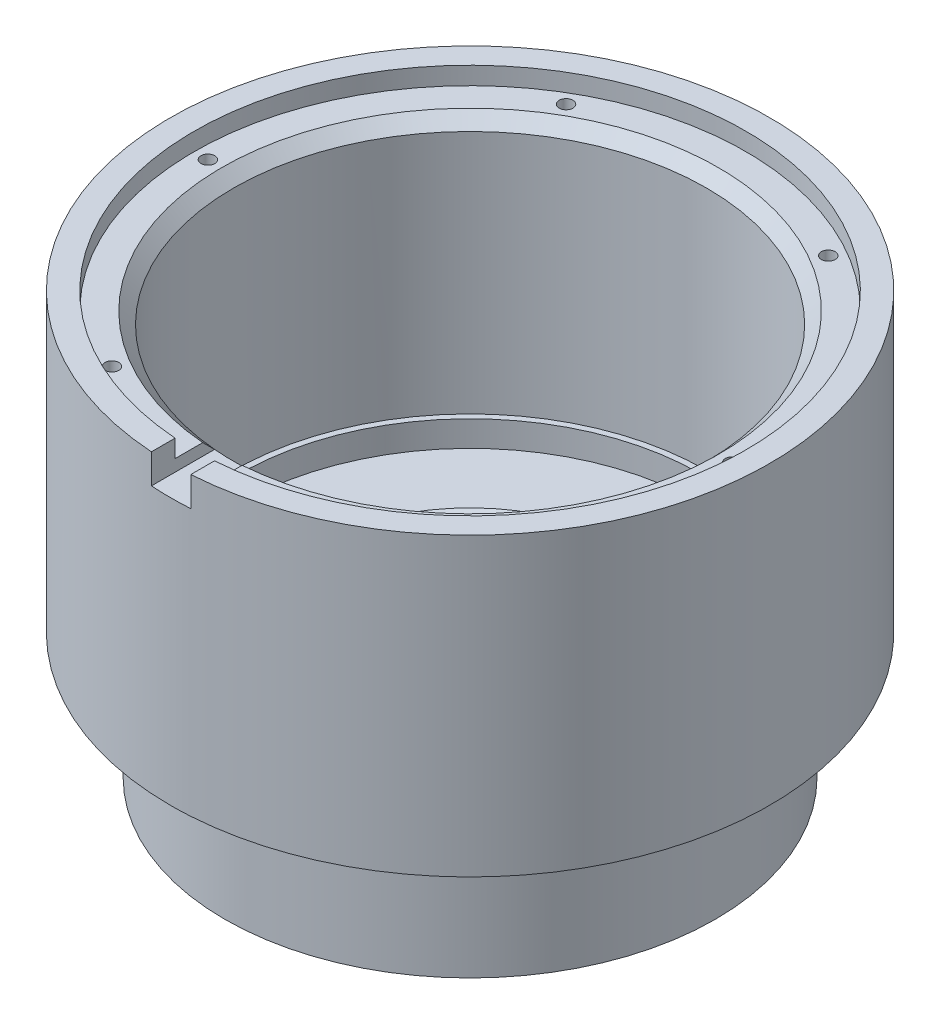
ISO-10303-21;
HEADER;
FILE_DESCRIPTION(('STEP AP214'),'2;1');
FILE_NAME('part.step','',(''),(''),'','','');
FILE_SCHEMA(('AUTOMOTIVE_DESIGN { 1 0 10303 214 1 1 1 1 }'));
ENDSEC;
DATA;
#1=APPLICATION_CONTEXT('core data for automotive mechanical design processes');
#2=APPLICATION_PROTOCOL_DEFINITION('international standard','automotive_design',2000,#1);
#3=PRODUCT_CONTEXT('',#1,'mechanical');
#4=PRODUCT('Part','Part','',(#3));
#5=PRODUCT_RELATED_PRODUCT_CATEGORY('part','',(#4));
#6=PRODUCT_DEFINITION_FORMATION('','',#4);
#7=PRODUCT_DEFINITION_CONTEXT('part definition',#1,'design');
#8=PRODUCT_DEFINITION('design','',#6,#7);
#9=PRODUCT_DEFINITION_SHAPE('','',#8);
#10=(LENGTH_UNIT() NAMED_UNIT(*) SI_UNIT(.MILLI.,.METRE.));
#11=(NAMED_UNIT(*) PLANE_ANGLE_UNIT() SI_UNIT($,.RADIAN.));
#12=(NAMED_UNIT(*) SI_UNIT($,.STERADIAN.) SOLID_ANGLE_UNIT());
#13=UNCERTAINTY_MEASURE_WITH_UNIT(LENGTH_MEASURE(1.E-05),#10,'distance_accuracy_value','');
#14=(GEOMETRIC_REPRESENTATION_CONTEXT(3) GLOBAL_UNCERTAINTY_ASSIGNED_CONTEXT((#13)) GLOBAL_UNIT_ASSIGNED_CONTEXT((#10,
#11,#12)) REPRESENTATION_CONTEXT('',''));
#15=CARTESIAN_POINT('',(0.,0.,0.));
#16=DIRECTION('',(0.,0.,1.));
#17=DIRECTION('',(1.,0.,0.));
#18=AXIS2_PLACEMENT_3D('',#15,#16,#17);
#19=CARTESIAN_POINT('',(-12.5,-14.25,0.));
#20=DIRECTION('',(0.,1.,0.));
#21=DIRECTION('',(0.,0.,1.));
#22=AXIS2_PLACEMENT_3D('',#19,#20,#21);
#23=PLANE('',#22);
#24=CARTESIAN_POINT('',(0.,-14.25,0.));
#25=DIRECTION('',(0.,-1.,0.));
#26=DIRECTION('',(0.,0.,-1.));
#27=AXIS2_PLACEMENT_3D('',#24,#25,#26);
#28=CIRCLE('',#27,12.5);
#29=CARTESIAN_POINT('',(0.,-14.25,-12.5));
#30=VERTEX_POINT('',#29);
#31=EDGE_CURVE('E220',#30,#30,#28,.T.);
#32=ORIENTED_EDGE('',*,*,#31,.F.);
#33=EDGE_LOOP('',(#32));
#34=FACE_BOUND('',#33,.T.);
#35=CARTESIAN_POINT('',(-12.634375,-14.25,21.883379421878));
#36=DIRECTION('',(0.,-1.,0.));
#37=DIRECTION('',(0.,0.,-1.));
#38=AXIS2_PLACEMENT_3D('',#35,#36,#37);
#39=CIRCLE('',#38,2.875);
#40=CARTESIAN_POINT('',(-12.634375,-14.25,19.008379421878));
#41=VERTEX_POINT('',#40);
#42=EDGE_CURVE('E297',#41,#41,#39,.T.);
#43=ORIENTED_EDGE('',*,*,#42,.F.);
#44=EDGE_LOOP('',(#43));
#45=FACE_BOUND('',#44,.T.);
#46=CARTESIAN_POINT('',(12.634375,-14.25,21.883379421878));
#47=DIRECTION('',(0.,-1.,0.));
#48=DIRECTION('',(0.,0.,-1.));
#49=AXIS2_PLACEMENT_3D('',#46,#47,#48);
#50=CIRCLE('',#49,2.875);
#51=CARTESIAN_POINT('',(12.634375,-14.25,19.008379421878));
#52=VERTEX_POINT('',#51);
#53=EDGE_CURVE('E291',#52,#52,#50,.T.);
#54=ORIENTED_EDGE('',*,*,#53,.F.);
#55=EDGE_LOOP('',(#54));
#56=FACE_BOUND('',#55,.T.);
#57=CARTESIAN_POINT('',(25.26875,-14.25,0.));
#58=DIRECTION('',(0.,-1.,0.));
#59=DIRECTION('',(0.,0.,-1.));
#60=AXIS2_PLACEMENT_3D('',#57,#58,#59);
#61=CIRCLE('',#60,2.875);
#62=CARTESIAN_POINT('',(25.26875,-14.25,-2.875));
#63=VERTEX_POINT('',#62);
#64=EDGE_CURVE('E285',#63,#63,#61,.T.);
#65=ORIENTED_EDGE('',*,*,#64,.F.);
#66=EDGE_LOOP('',(#65));
#67=FACE_BOUND('',#66,.T.);
#68=CARTESIAN_POINT('',(12.634375,-14.25,-21.883379421878));
#69=DIRECTION('',(0.,-1.,0.));
#70=DIRECTION('',(0.,0.,-1.));
#71=AXIS2_PLACEMENT_3D('',#68,#69,#70);
#72=CIRCLE('',#71,2.875);
#73=CARTESIAN_POINT('',(12.634375,-14.25,-24.758379421878));
#74=VERTEX_POINT('',#73);
#75=EDGE_CURVE('E278',#74,#74,#72,.T.);
#76=ORIENTED_EDGE('',*,*,#75,.F.);
#77=EDGE_LOOP('',(#76));
#78=FACE_BOUND('',#77,.T.);
#79=CARTESIAN_POINT('',(-12.634375,-14.25,-21.883379421878));
#80=DIRECTION('',(0.,-1.,0.));
#81=DIRECTION('',(0.,0.,-1.));
#82=AXIS2_PLACEMENT_3D('',#79,#80,#81);
#83=CIRCLE('',#82,2.875);
#84=CARTESIAN_POINT('',(-12.634375,-14.25,-24.758379421878));
#85=VERTEX_POINT('',#84);
#86=EDGE_CURVE('E279',#85,#85,#83,.T.);
#87=ORIENTED_EDGE('',*,*,#86,.F.);
#88=EDGE_LOOP('',(#87));
#89=FACE_BOUND('',#88,.T.);
#90=CARTESIAN_POINT('',(-25.26875,-14.25,0.));
#91=DIRECTION('',(0.,-1.,0.));
#92=DIRECTION('',(0.,0.,-1.));
#93=AXIS2_PLACEMENT_3D('',#90,#91,#92);
#94=CIRCLE('',#93,2.875);
#95=CARTESIAN_POINT('',(-25.26875,-14.25,-2.875));
#96=VERTEX_POINT('',#95);
#97=EDGE_CURVE('E300',#96,#96,#94,.T.);
#98=ORIENTED_EDGE('',*,*,#97,.F.);
#99=EDGE_LOOP('',(#98));
#100=FACE_BOUND('',#99,.T.);
#101=CARTESIAN_POINT('',(0.,-14.25,0.));
#102=DIRECTION('',(0.,1.,0.));
#103=DIRECTION('',(0.,0.,1.));
#104=AXIS2_PLACEMENT_3D('',#101,#102,#103);
#105=CIRCLE('',#104,31.14375);
#106=CARTESIAN_POINT('',(0.,-14.25,31.14375));
#107=VERTEX_POINT('',#106);
#108=EDGE_CURVE('E304',#107,#107,#105,.T.);
#109=ORIENTED_EDGE('',*,*,#108,.F.);
#110=EDGE_LOOP('',(#109));
#111=FACE_BOUND('',#110,.T.);
#112=ADVANCED_FACE('F43',(#34,#45,#56,#67,#78,#89,#100,#111),#23,.F.);
#113=CARTESIAN_POINT('',(0.,-30.2318711174091,0.));
#114=DIRECTION('',(0.,-1.,0.));
#115=DIRECTION('',(0.,0.,-1.));
#116=AXIS2_PLACEMENT_3D('',#113,#114,#115);
#117=CYLINDRICAL_SURFACE('',#116,38.0375);
#118=CARTESIAN_POINT('',(0.,1.730108418226,0.));
#119=DIRECTION('',(0.,1.,0.));
#120=DIRECTION('',(0.,0.,1.));
#121=AXIS2_PLACEMENT_3D('',#118,#119,#120);
#122=CIRCLE('',#121,38.0375);
#123=CARTESIAN_POINT('',(0.,1.730108418226,38.0375));
#124=VERTEX_POINT('',#123);
#125=EDGE_CURVE('E189',#124,#124,#122,.T.);
#126=ORIENTED_EDGE('',*,*,#125,.T.);
#127=EDGE_LOOP('',(#126));
#128=FACE_BOUND('',#127,.T.);
#129=CARTESIAN_POINT('',(0.,39.31,0.));
#130=DIRECTION('',(0.,-1.,0.));
#131=DIRECTION('',(0.,0.,-1.));
#132=AXIS2_PLACEMENT_3D('',#129,#130,#131);
#133=CIRCLE('',#132,38.0375);
#134=CARTESIAN_POINT('',(-2.5,39.31,37.9552553179399));
#135=VERTEX_POINT('',#134);
#136=CARTESIAN_POINT('',(2.5,39.31,37.9552553179399));
#137=VERTEX_POINT('',#136);
#138=EDGE_CURVE('E193',#135,#137,#133,.T.);
#139=ORIENTED_EDGE('',*,*,#138,.T.);
#140=DIRECTION('',(0.,-1.,0.));
#141=VECTOR('',#140,1.);
#142=CARTESIAN_POINT('',(2.5,-30.2318711174091,37.9552553179399));
#143=LINE('',#142,#141);
#144=CARTESIAN_POINT('',(2.5,35.56,37.9552553179399));
#145=VERTEX_POINT('',#144);
#146=EDGE_CURVE('E194',#137,#145,#143,.T.);
#147=ORIENTED_EDGE('',*,*,#146,.T.);
#148=CARTESIAN_POINT('',(0.,35.56,0.));
#149=DIRECTION('',(0.,-1.,0.));
#150=DIRECTION('',(0.,0.,-1.));
#151=AXIS2_PLACEMENT_3D('',#148,#149,#150);
#152=CIRCLE('',#151,38.0375);
#153=CARTESIAN_POINT('',(-2.5,35.56,37.9552553179399));
#154=VERTEX_POINT('',#153);
#155=EDGE_CURVE('E116',#145,#154,#152,.T.);
#156=ORIENTED_EDGE('',*,*,#155,.T.);
#157=DIRECTION('',(0.,-1.,0.));
#158=VECTOR('',#157,1.);
#159=CARTESIAN_POINT('',(-2.5,-30.2318711174091,37.9552553179399));
#160=LINE('',#159,#158);
#161=EDGE_CURVE('E195',#154,#135,#160,.F.);
#162=ORIENTED_EDGE('',*,*,#161,.T.);
#163=EDGE_LOOP('',(#139,#147,#156,#162));
#164=FACE_BOUND('',#163,.T.);
#165=ADVANCED_FACE('F147',(#128,#164),#117,.T.);
#166=CARTESIAN_POINT('',(-38.0375,39.31,0.));
#167=DIRECTION('',(0.,-1.,0.));
#168=DIRECTION('',(0.,0.,-1.));
#169=AXIS2_PLACEMENT_3D('',#166,#167,#168);
#170=PLANE('',#169);
#171=CARTESIAN_POINT('',(0.,39.31,0.));
#172=DIRECTION('',(0.,-1.,0.));
#173=DIRECTION('',(0.,0.,-1.));
#174=AXIS2_PLACEMENT_3D('',#171,#172,#173);
#175=CIRCLE('',#174,35.0375);
#176=CARTESIAN_POINT('',(-2.5,39.31,34.9481960371347));
#177=VERTEX_POINT('',#176);
#178=CARTESIAN_POINT('',(2.5,39.31,34.9481960371347));
#179=VERTEX_POINT('',#178);
#180=EDGE_CURVE('E198',#177,#179,#175,.T.);
#181=ORIENTED_EDGE('',*,*,#180,.T.);
#182=DIRECTION('',(0.,0.,-1.));
#183=VECTOR('',#182,1.);
#184=CARTESIAN_POINT('',(2.5,39.31,38.0375));
#185=LINE('',#184,#183);
#186=EDGE_CURVE('E117',#137,#179,#185,.T.);
#187=ORIENTED_EDGE('',*,*,#186,.F.);
#188=ORIENTED_EDGE('',*,*,#138,.F.);
#189=DIRECTION('',(0.,0.,1.));
#190=VECTOR('',#189,1.);
#191=CARTESIAN_POINT('',(-2.5,39.31,38.0375));
#192=LINE('',#191,#190);
#193=EDGE_CURVE('E235',#177,#135,#192,.T.);
#194=ORIENTED_EDGE('',*,*,#193,.F.);
#195=EDGE_LOOP('',(#181,#187,#188,#194));
#196=FACE_BOUND('',#195,.T.);
#197=ADVANCED_FACE('F178',(#196),#170,.F.);
#198=CARTESIAN_POINT('',(0.,-30.2318711174091,0.));
#199=DIRECTION('',(0.,-1.,0.));
#200=DIRECTION('',(0.,0.,-1.));
#201=AXIS2_PLACEMENT_3D('',#198,#199,#200);
#202=CYLINDRICAL_SURFACE('',#201,35.0375);
#203=CARTESIAN_POINT('',(0.,37.06,0.));
#204=DIRECTION('',(0.,-1.,0.));
#205=DIRECTION('',(0.,0.,-1.));
#206=AXIS2_PLACEMENT_3D('',#203,#204,#205);
#207=CIRCLE('',#206,35.0375);
#208=CARTESIAN_POINT('',(-2.5,37.06,34.9481960371347));
#209=VERTEX_POINT('',#208);
#210=CARTESIAN_POINT('',(2.5,37.06,34.9481960371347));
#211=VERTEX_POINT('',#210);
#212=EDGE_CURVE('E200',#209,#211,#207,.T.);
#213=ORIENTED_EDGE('',*,*,#212,.T.);
#214=DIRECTION('',(0.,-1.,0.));
#215=VECTOR('',#214,1.);
#216=CARTESIAN_POINT('',(2.5,-30.2318711174091,34.9481960371347));
#217=LINE('',#216,#215);
#218=EDGE_CURVE('E73',#211,#179,#217,.F.);
#219=ORIENTED_EDGE('',*,*,#218,.T.);
#220=ORIENTED_EDGE('',*,*,#180,.F.);
#221=DIRECTION('',(0.,-1.,0.));
#222=VECTOR('',#221,1.);
#223=CARTESIAN_POINT('',(-2.5,-30.2318711174091,34.9481960371347));
#224=LINE('',#223,#222);
#225=EDGE_CURVE('E228',#177,#209,#224,.T.);
#226=ORIENTED_EDGE('',*,*,#225,.T.);
#227=EDGE_LOOP('',(#213,#219,#220,#226));
#228=FACE_BOUND('',#227,.T.);
#229=ADVANCED_FACE('F174',(#228),#202,.F.);
#230=CARTESIAN_POINT('',(-35.0375,37.06,0.));
#231=DIRECTION('',(0.,-1.,0.));
#232=DIRECTION('',(0.,0.,-1.));
#233=AXIS2_PLACEMENT_3D('',#230,#231,#232);
#234=PLANE('',#233);
#235=CARTESIAN_POINT('',(-33.2875,37.06,0.));
#236=DIRECTION('',(0.,1.,0.));
#237=DIRECTION('',(0.,0.,1.));
#238=AXIS2_PLACEMENT_3D('',#235,#236,#237);
#239=CIRCLE('',#238,0.874999999999998);
#240=CARTESIAN_POINT('',(-33.2875,37.06,0.874999999999998));
#241=VERTEX_POINT('',#240);
#242=EDGE_CURVE('E264',#241,#241,#239,.T.);
#243=ORIENTED_EDGE('',*,*,#242,.F.);
#244=EDGE_LOOP('',(#243));
#245=FACE_BOUND('',#244,.T.);
#246=CARTESIAN_POINT('',(-16.64375,37.06,28.8278206284745));
#247=DIRECTION('',(0.,1.,0.));
#248=DIRECTION('',(0.,0.,1.));
#249=AXIS2_PLACEMENT_3D('',#246,#247,#248);
#250=CIRCLE('',#249,0.875000000000002);
#251=CARTESIAN_POINT('',(-16.64375,37.06,29.7028206284745));
#252=VERTEX_POINT('',#251);
#253=EDGE_CURVE('E243',#252,#252,#250,.T.);
#254=ORIENTED_EDGE('',*,*,#253,.F.);
#255=EDGE_LOOP('',(#254));
#256=FACE_BOUND('',#255,.T.);
#257=CARTESIAN_POINT('',(16.64375,37.06,28.8278206284745));
#258=DIRECTION('',(0.,1.,0.));
#259=DIRECTION('',(0.,0.,1.));
#260=AXIS2_PLACEMENT_3D('',#257,#258,#259);
#261=CIRCLE('',#260,0.875000000000002);
#262=CARTESIAN_POINT('',(16.64375,37.06,29.7028206284745));
#263=VERTEX_POINT('',#262);
#264=EDGE_CURVE('E242',#263,#263,#261,.T.);
#265=ORIENTED_EDGE('',*,*,#264,.F.);
#266=EDGE_LOOP('',(#265));
#267=FACE_BOUND('',#266,.T.);
#268=CARTESIAN_POINT('',(33.2875,37.06,0.));
#269=DIRECTION('',(0.,1.,0.));
#270=DIRECTION('',(0.,0.,1.));
#271=AXIS2_PLACEMENT_3D('',#268,#269,#270);
#272=CIRCLE('',#271,0.874999999999998);
#273=CARTESIAN_POINT('',(33.2875,37.06,0.874999999999995));
#274=VERTEX_POINT('',#273);
#275=EDGE_CURVE('E249',#274,#274,#272,.T.);
#276=ORIENTED_EDGE('',*,*,#275,.F.);
#277=EDGE_LOOP('',(#276));
#278=FACE_BOUND('',#277,.T.);
#279=CARTESIAN_POINT('',(16.64375,37.06,-28.8278206284745));
#280=DIRECTION('',(0.,1.,0.));
#281=DIRECTION('',(0.,0.,1.));
#282=AXIS2_PLACEMENT_3D('',#279,#280,#281);
#283=CIRCLE('',#282,0.875000000000002);
#284=CARTESIAN_POINT('',(16.64375,37.06,-27.9528206284745));
#285=VERTEX_POINT('',#284);
#286=EDGE_CURVE('E255',#285,#285,#283,.T.);
#287=ORIENTED_EDGE('',*,*,#286,.F.);
#288=EDGE_LOOP('',(#287));
#289=FACE_BOUND('',#288,.T.);
#290=CARTESIAN_POINT('',(-16.64375,37.06,-28.8278206284745));
#291=DIRECTION('',(0.,1.,0.));
#292=DIRECTION('',(0.,0.,1.));
#293=AXIS2_PLACEMENT_3D('',#290,#291,#292);
#294=CIRCLE('',#293,0.875000000000002);
#295=CARTESIAN_POINT('',(-16.64375,37.06,-27.9528206284745));
#296=VERTEX_POINT('',#295);
#297=EDGE_CURVE('E261',#296,#296,#294,.T.);
#298=ORIENTED_EDGE('',*,*,#297,.F.);
#299=EDGE_LOOP('',(#298));
#300=FACE_BOUND('',#299,.T.);
#301=CARTESIAN_POINT('',(0.,37.06,0.));
#302=DIRECTION('',(0.,-1.,0.));
#303=DIRECTION('',(0.,0.,-1.));
#304=AXIS2_PLACEMENT_3D('',#301,#302,#303);
#305=CIRCLE('',#304,31.5375);
#306=CARTESIAN_POINT('',(-2.5,37.06,31.4382554581198));
#307=VERTEX_POINT('',#306);
#308=CARTESIAN_POINT('',(2.5,37.06,31.4382554581198));
#309=VERTEX_POINT('',#308);
#310=EDGE_CURVE('E122',#307,#309,#305,.T.);
#311=ORIENTED_EDGE('',*,*,#310,.T.);
#312=DIRECTION('',(0.,0.,1.));
#313=VECTOR('',#312,1.);
#314=CARTESIAN_POINT('',(2.49999999999999,37.06,0.));
#315=LINE('',#314,#313);
#316=EDGE_CURVE('E106',#309,#211,#315,.T.);
#317=ORIENTED_EDGE('',*,*,#316,.T.);
#318=ORIENTED_EDGE('',*,*,#212,.F.);
#319=DIRECTION('',(0.,0.,-1.));
#320=VECTOR('',#319,1.);
#321=CARTESIAN_POINT('',(-2.5,37.06,0.));
#322=LINE('',#321,#320);
#323=EDGE_CURVE('E231',#209,#307,#322,.T.);
#324=ORIENTED_EDGE('',*,*,#323,.T.);
#325=EDGE_LOOP('',(#311,#317,#318,#324));
#326=FACE_BOUND('',#325,.T.);
#327=ADVANCED_FACE('F171',(#245,#256,#267,#278,#289,#300,#326),#234,.F.);
#328=CARTESIAN_POINT('',(0.,-30.2318711174091,0.));
#329=DIRECTION('',(0.,-1.,0.));
#330=DIRECTION('',(0.,0.,-1.));
#331=AXIS2_PLACEMENT_3D('',#328,#329,#330);
#332=CYLINDRICAL_SURFACE('',#331,30.0375);
#333=CARTESIAN_POINT('',(0.,35.56,0.));
#334=DIRECTION('',(0.,-1.,0.));
#335=DIRECTION('',(0.,0.,-1.));
#336=AXIS2_PLACEMENT_3D('',#333,#334,#335);
#337=CIRCLE('',#336,30.0375);
#338=CARTESIAN_POINT('',(-2.5,35.56,29.9332825839399));
#339=VERTEX_POINT('',#338);
#340=CARTESIAN_POINT('',(2.5,35.56,29.9332825839399));
#341=VERTEX_POINT('',#340);
#342=EDGE_CURVE('E114',#339,#341,#337,.F.);
#343=ORIENTED_EDGE('',*,*,#342,.T.);
#344=EDGE_CURVE('E120',#341,#339,#337,.F.);
#345=ORIENTED_EDGE('',*,*,#344,.T.);
#346=EDGE_LOOP('',(#343,#345));
#347=FACE_BOUND('',#346,.T.);
#348=CARTESIAN_POINT('',(0.,4.50500000000001,0.));
#349=DIRECTION('',(0.,-1.,0.));
#350=DIRECTION('',(0.,0.,-1.));
#351=AXIS2_PLACEMENT_3D('',#348,#349,#350);
#352=CIRCLE('',#351,30.0375);
#353=CARTESIAN_POINT('',(0.,4.50500000000001,-30.0375));
#354=VERTEX_POINT('',#353);
#355=EDGE_CURVE('E205',#354,#354,#352,.T.);
#356=ORIENTED_EDGE('',*,*,#355,.T.);
#357=EDGE_LOOP('',(#356));
#358=FACE_BOUND('',#357,.T.);
#359=ADVANCED_FACE('F124',(#347,#358),#332,.F.);
#360=CARTESIAN_POINT('',(-30.0375,4.50500000000001,0.));
#361=DIRECTION('',(0.,-1.,0.));
#362=DIRECTION('',(0.,0.,-1.));
#363=AXIS2_PLACEMENT_3D('',#360,#361,#362);
#364=PLANE('',#363);
#365=ORIENTED_EDGE('',*,*,#355,.F.);
#366=EDGE_LOOP('',(#365));
#367=FACE_BOUND('',#366,.T.);
#368=CARTESIAN_POINT('',(0.,4.50500000000001,0.));
#369=DIRECTION('',(0.,-1.,0.));
#370=DIRECTION('',(0.,0.,-1.));
#371=AXIS2_PLACEMENT_3D('',#368,#369,#370);
#372=CIRCLE('',#371,29.2875);
#373=CARTESIAN_POINT('',(0.,4.50500000000001,-29.2875));
#374=VERTEX_POINT('',#373);
#375=EDGE_CURVE('E208',#374,#374,#372,.T.);
#376=ORIENTED_EDGE('',*,*,#375,.T.);
#377=EDGE_LOOP('',(#376));
#378=FACE_BOUND('',#377,.T.);
#379=ADVANCED_FACE('F164',(#367,#378),#364,.F.);
#380=CARTESIAN_POINT('',(0.,-30.2318711174091,0.));
#381=DIRECTION('',(0.,-1.,0.));
#382=DIRECTION('',(0.,0.,-1.));
#383=AXIS2_PLACEMENT_3D('',#380,#381,#382);
#384=CYLINDRICAL_SURFACE('',#383,29.2875);
#385=ORIENTED_EDGE('',*,*,#375,.F.);
#386=EDGE_LOOP('',(#385));
#387=FACE_BOUND('',#386,.T.);
#388=CARTESIAN_POINT('',(0.,1.25,0.));
#389=DIRECTION('',(0.,-1.,0.));
#390=DIRECTION('',(0.,0.,-1.));
#391=AXIS2_PLACEMENT_3D('',#388,#389,#390);
#392=CIRCLE('',#391,29.2875);
#393=CARTESIAN_POINT('',(0.,1.25,-29.2875));
#394=VERTEX_POINT('',#393);
#395=EDGE_CURVE('E211',#394,#394,#392,.T.);
#396=ORIENTED_EDGE('',*,*,#395,.T.);
#397=EDGE_LOOP('',(#396));
#398=FACE_BOUND('',#397,.T.);
#399=ADVANCED_FACE('F160',(#387,#398),#384,.F.);
#400=CARTESIAN_POINT('',(-20.0375,1.25,0.));
#401=DIRECTION('',(0.,-1.,0.));
#402=DIRECTION('',(0.,0.,-1.));
#403=AXIS2_PLACEMENT_3D('',#400,#401,#402);
#404=PLANE('',#403);
#405=ORIENTED_EDGE('',*,*,#395,.F.);
#406=EDGE_LOOP('',(#405));
#407=FACE_BOUND('',#406,.T.);
#408=CARTESIAN_POINT('',(0.,1.25,0.));
#409=DIRECTION('',(0.,-1.,0.));
#410=DIRECTION('',(0.,0.,-1.));
#411=AXIS2_PLACEMENT_3D('',#408,#409,#410);
#412=CIRCLE('',#411,20.0375);
#413=CARTESIAN_POINT('',(0.,1.25,-20.0375));
#414=VERTEX_POINT('',#413);
#415=EDGE_CURVE('E214',#414,#414,#412,.T.);
#416=ORIENTED_EDGE('',*,*,#415,.T.);
#417=EDGE_LOOP('',(#416));
#418=FACE_BOUND('',#417,.T.);
#419=ADVANCED_FACE('F156',(#407,#418),#404,.F.);
#420=CARTESIAN_POINT('',(0.,-1.25,0.));
#421=DIRECTION('',(0.,1.,0.));
#422=DIRECTION('',(0.,0.,1.));
#423=AXIS2_PLACEMENT_3D('',#420,#421,#422);
#424=CONICAL_SURFACE('',#423,12.5,1.25053905152723);
#425=ORIENTED_EDGE('',*,*,#415,.F.);
#426=EDGE_LOOP('',(#425));
#427=FACE_BOUND('',#426,.T.);
#428=CARTESIAN_POINT('',(0.,-1.25,0.));
#429=DIRECTION('',(0.,-1.,0.));
#430=DIRECTION('',(0.,0.,-1.));
#431=AXIS2_PLACEMENT_3D('',#428,#429,#430);
#432=CIRCLE('',#431,12.5);
#433=CARTESIAN_POINT('',(0.,-1.25,-12.5));
#434=VERTEX_POINT('',#433);
#435=EDGE_CURVE('E217',#434,#434,#432,.T.);
#436=ORIENTED_EDGE('',*,*,#435,.T.);
#437=EDGE_LOOP('',(#436));
#438=FACE_BOUND('',#437,.T.);
#439=ADVANCED_FACE('F152',(#427,#438),#424,.F.);
#440=CARTESIAN_POINT('',(0.,-30.2318711174091,0.));
#441=DIRECTION('',(0.,-1.,0.));
#442=DIRECTION('',(0.,0.,-1.));
#443=AXIS2_PLACEMENT_3D('',#440,#441,#442);
#444=CYLINDRICAL_SURFACE('',#443,12.5);
#445=ORIENTED_EDGE('',*,*,#435,.F.);
#446=EDGE_LOOP('',(#445));
#447=FACE_BOUND('',#446,.T.);
#448=ORIENTED_EDGE('',*,*,#31,.T.);
#449=EDGE_LOOP('',(#448));
#450=FACE_BOUND('',#449,.T.);
#451=ADVANCED_FACE('F149',(#447,#450),#444,.F.);
#452=CARTESIAN_POINT('',(0.,37.06,0.));
#453=DIRECTION('',(0.,1.,0.));
#454=DIRECTION('',(0.,0.,1.));
#455=AXIS2_PLACEMENT_3D('',#452,#453,#454);
#456=CONICAL_SURFACE('',#455,31.5375,0.785398163397436);
#457=CARTESIAN_POINT('',(2.5,39.2564498760365,33.6411856842017));
#458=CARTESIAN_POINT('',(2.5,38.7659165604654,33.1492992082919));
#459=CARTESIAN_POINT('',(2.5,38.2754123379568,32.6573837168512));
#460=CARTESIAN_POINT('',(2.5,37.2944718161019,31.6734850406487));
#461=CARTESIAN_POINT('',(2.5,36.8040355167539,31.1815018558887));
#462=CARTESIAN_POINT('',(2.5,35.8232405497736,30.1974581022259));
#463=CARTESIAN_POINT('',(2.5,35.3328818821417,29.7053975333225));
#464=CARTESIAN_POINT('',(2.5,34.3522551657301,28.7211860822988));
#465=CARTESIAN_POINT('',(2.5,33.8619871169527,28.2290352001761));
#466=CARTESIAN_POINT('',(2.5,33.3717708821294,27.7368327079034));
#467=B_SPLINE_CURVE_WITH_KNOTS('',3,(#457,#458,#459,#460,#461,#462,#463,#464,#465,#466),
.UNSPECIFIED.,.F.,.F.,(4,2,2,2,4),(0.,2.08402906775415,4.1680580820119,6.25208711029352,
8.33611619216041),.UNSPECIFIED.);
#468=EDGE_CURVE('E12',#309,#341,#467,.T.);
#469=ORIENTED_EDGE('',*,*,#468,.F.);
#470=ORIENTED_EDGE('',*,*,#310,.F.);
#471=CARTESIAN_POINT('',(-2.5,33.3717708821294,27.7368327079034));
#472=CARTESIAN_POINT('',(-2.5,33.8619871169527,28.2290352001761));
#473=CARTESIAN_POINT('',(-2.5,34.3522551657301,28.7211860822988));
#474=CARTESIAN_POINT('',(-2.5,35.3328818821417,29.7053975333225));
#475=CARTESIAN_POINT('',(-2.5,35.8232405497736,30.1974581022259));
#476=CARTESIAN_POINT('',(-2.5,36.8040355167539,31.1815018558887));
#477=CARTESIAN_POINT('',(-2.5,37.2944718161019,31.6734850406487));
#478=CARTESIAN_POINT('',(-2.5,38.2754123379567,32.6573837168512));
#479=CARTESIAN_POINT('',(-2.5,38.7659165604654,33.1492992082919));
#480=CARTESIAN_POINT('',(-2.5,39.2564498760365,33.6411856842017));
#481=B_SPLINE_CURVE_WITH_KNOTS('',3,(#471,#472,#473,#474,#475,#476,#477,#478,#479,#480),
.UNSPECIFIED.,.F.,.F.,(4,2,2,2,4),(0.,2.08402908186689,4.16805811014851,6.25208712440626,
8.33611619216041),.UNSPECIFIED.);
#482=EDGE_CURVE('E58',#339,#307,#481,.T.);
#483=ORIENTED_EDGE('',*,*,#482,.F.);
#484=ORIENTED_EDGE('',*,*,#344,.F.);
#485=EDGE_LOOP('',(#469,#470,#483,#484));
#486=FACE_BOUND('',#485,.T.);
#487=ADVANCED_FACE('F46',(#486),#456,.F.);
#488=CARTESIAN_POINT('',(0.,35.56,0.));
#489=DIRECTION('',(0.,-1.,0.));
#490=DIRECTION('',(0.,0.,-1.));
#491=AXIS2_PLACEMENT_3D('',#488,#489,#490);
#492=PLANE('',#491);
#493=DIRECTION('',(0.,0.,-1.));
#494=VECTOR('',#493,1.);
#495=CARTESIAN_POINT('',(2.5,35.56,38.0375));
#496=LINE('',#495,#494);
#497=EDGE_CURVE('E104',#145,#341,#496,.T.);
#498=ORIENTED_EDGE('',*,*,#497,.T.);
#499=ORIENTED_EDGE('',*,*,#342,.F.);
#500=DIRECTION('',(0.,0.,1.));
#501=VECTOR('',#500,1.);
#502=CARTESIAN_POINT('',(-2.5,35.56,38.0375));
#503=LINE('',#502,#501);
#504=EDGE_CURVE('E65',#339,#154,#503,.T.);
#505=ORIENTED_EDGE('',*,*,#504,.T.);
#506=ORIENTED_EDGE('',*,*,#155,.F.);
#507=EDGE_LOOP('',(#498,#499,#505,#506));
#508=FACE_BOUND('',#507,.T.);
#509=ADVANCED_FACE('F112',(#508),#492,.F.);
#510=CARTESIAN_POINT('',(2.5,26.0374824795765,38.0375));
#511=DIRECTION('',(1.,0.,0.));
#512=DIRECTION('',(0.,0.,-1.));
#513=AXIS2_PLACEMENT_3D('',#510,#511,#512);
#514=PLANE('',#513);
#515=ORIENTED_EDGE('',*,*,#186,.T.);
#516=ORIENTED_EDGE('',*,*,#218,.F.);
#517=ORIENTED_EDGE('',*,*,#316,.F.);
#518=ORIENTED_EDGE('',*,*,#468,.T.);
#519=ORIENTED_EDGE('',*,*,#497,.F.);
#520=ORIENTED_EDGE('',*,*,#146,.F.);
#521=EDGE_LOOP('',(#515,#516,#517,#518,#519,#520));
#522=FACE_BOUND('',#521,.T.);
#523=ADVANCED_FACE('F103',(#522),#514,.F.);
#524=CARTESIAN_POINT('',(-2.5,26.0374824795765,38.0375));
#525=DIRECTION('',(-1.,0.,0.));
#526=DIRECTION('',(0.,0.,1.));
#527=AXIS2_PLACEMENT_3D('',#524,#525,#526);
#528=PLANE('',#527);
#529=ORIENTED_EDGE('',*,*,#504,.F.);
#530=ORIENTED_EDGE('',*,*,#482,.T.);
#531=ORIENTED_EDGE('',*,*,#323,.F.);
#532=ORIENTED_EDGE('',*,*,#225,.F.);
#533=ORIENTED_EDGE('',*,*,#193,.T.);
#534=ORIENTED_EDGE('',*,*,#161,.F.);
#535=EDGE_LOOP('',(#529,#530,#531,#532,#533,#534));
#536=FACE_BOUND('',#535,.T.);
#537=ADVANCED_FACE('F133',(#536),#528,.F.);
#538=CARTESIAN_POINT('',(-16.64375,31.06,-28.8278206284745));
#539=DIRECTION('',(0.,1.,0.));
#540=DIRECTION('',(0.,0.,1.));
#541=AXIS2_PLACEMENT_3D('',#538,#539,#540);
#542=CYLINDRICAL_SURFACE('',#541,0.875000000000002);
#543=CARTESIAN_POINT('',(-16.64375,31.06,-28.8278206284745));
#544=DIRECTION('',(0.,1.,0.));
#545=DIRECTION('',(0.,0.,1.));
#546=AXIS2_PLACEMENT_3D('',#543,#544,#545);
#547=CIRCLE('',#546,0.875000000000002);
#548=CARTESIAN_POINT('',(-16.64375,31.06,-27.9528206284745));
#549=VERTEX_POINT('',#548);
#550=EDGE_CURVE('E258',#549,#549,#547,.T.);
#551=ORIENTED_EDGE('',*,*,#550,.F.);
#552=EDGE_LOOP('',(#551));
#553=FACE_BOUND('',#552,.T.);
#554=ORIENTED_EDGE('',*,*,#297,.T.);
#555=EDGE_LOOP('',(#554));
#556=FACE_BOUND('',#555,.T.);
#557=ADVANCED_FACE('F137',(#553,#556),#542,.F.);
#558=CARTESIAN_POINT('',(-16.64375,31.06,-28.8278206284745));
#559=DIRECTION('',(0.,1.,0.));
#560=DIRECTION('',(0.,0.,1.));
#561=AXIS2_PLACEMENT_3D('',#558,#559,#560);
#562=PLANE('',#561);
#563=ORIENTED_EDGE('',*,*,#550,.T.);
#564=EDGE_LOOP('',(#563));
#565=FACE_BOUND('',#564,.T.);
#566=ADVANCED_FACE('F398',(#565),#562,.T.);
#567=CARTESIAN_POINT('',(16.64375,31.06,-28.8278206284745));
#568=DIRECTION('',(0.,1.,0.));
#569=DIRECTION('',(0.,0.,1.));
#570=AXIS2_PLACEMENT_3D('',#567,#568,#569);
#571=CYLINDRICAL_SURFACE('',#570,0.875000000000002);
#572=CARTESIAN_POINT('',(16.64375,31.06,-28.8278206284745));
#573=DIRECTION('',(0.,1.,0.));
#574=DIRECTION('',(0.,0.,1.));
#575=AXIS2_PLACEMENT_3D('',#572,#573,#574);
#576=CIRCLE('',#575,0.875000000000002);
#577=CARTESIAN_POINT('',(16.64375,31.06,-27.9528206284745));
#578=VERTEX_POINT('',#577);
#579=EDGE_CURVE('E252',#578,#578,#576,.T.);
#580=ORIENTED_EDGE('',*,*,#579,.F.);
#581=EDGE_LOOP('',(#580));
#582=FACE_BOUND('',#581,.T.);
#583=ORIENTED_EDGE('',*,*,#286,.T.);
#584=EDGE_LOOP('',(#583));
#585=FACE_BOUND('',#584,.T.);
#586=ADVANCED_FACE('F402',(#582,#585),#571,.F.);
#587=CARTESIAN_POINT('',(16.64375,31.06,-28.8278206284745));
#588=DIRECTION('',(0.,1.,0.));
#589=DIRECTION('',(0.,0.,1.));
#590=AXIS2_PLACEMENT_3D('',#587,#588,#589);
#591=PLANE('',#590);
#592=ORIENTED_EDGE('',*,*,#579,.T.);
#593=EDGE_LOOP('',(#592));
#594=FACE_BOUND('',#593,.T.);
#595=ADVANCED_FACE('F406',(#594),#591,.T.);
#596=CARTESIAN_POINT('',(33.2875,31.06,0.));
#597=DIRECTION('',(0.,1.,0.));
#598=DIRECTION('',(0.,0.,1.));
#599=AXIS2_PLACEMENT_3D('',#596,#597,#598);
#600=CYLINDRICAL_SURFACE('',#599,0.874999999999998);
#601=CARTESIAN_POINT('',(33.2875,31.06,0.));
#602=DIRECTION('',(0.,1.,0.));
#603=DIRECTION('',(0.,0.,1.));
#604=AXIS2_PLACEMENT_3D('',#601,#602,#603);
#605=CIRCLE('',#604,0.874999999999998);
#606=CARTESIAN_POINT('',(33.2875,31.06,0.874999999999995));
#607=VERTEX_POINT('',#606);
#608=EDGE_CURVE('E246',#607,#607,#605,.T.);
#609=ORIENTED_EDGE('',*,*,#608,.F.);
#610=EDGE_LOOP('',(#609));
#611=FACE_BOUND('',#610,.T.);
#612=ORIENTED_EDGE('',*,*,#275,.T.);
#613=EDGE_LOOP('',(#612));
#614=FACE_BOUND('',#613,.T.);
#615=ADVANCED_FACE('F410',(#611,#614),#600,.F.);
#616=CARTESIAN_POINT('',(33.2875,31.06,0.));
#617=DIRECTION('',(0.,1.,0.));
#618=DIRECTION('',(0.,0.,1.));
#619=AXIS2_PLACEMENT_3D('',#616,#617,#618);
#620=PLANE('',#619);
#621=ORIENTED_EDGE('',*,*,#608,.T.);
#622=EDGE_LOOP('',(#621));
#623=FACE_BOUND('',#622,.T.);
#624=ADVANCED_FACE('F414',(#623),#620,.T.);
#625=CARTESIAN_POINT('',(16.64375,31.06,28.8278206284745));
#626=DIRECTION('',(0.,1.,0.));
#627=DIRECTION('',(0.,0.,1.));
#628=AXIS2_PLACEMENT_3D('',#625,#626,#627);
#629=CYLINDRICAL_SURFACE('',#628,0.875000000000002);
#630=CARTESIAN_POINT('',(16.64375,31.06,28.8278206284745));
#631=DIRECTION('',(0.,1.,0.));
#632=DIRECTION('',(0.,0.,1.));
#633=AXIS2_PLACEMENT_3D('',#630,#631,#632);
#634=CIRCLE('',#633,0.875000000000002);
#635=CARTESIAN_POINT('',(16.64375,31.06,29.7028206284745));
#636=VERTEX_POINT('',#635);
#637=EDGE_CURVE('E239',#636,#636,#634,.T.);
#638=ORIENTED_EDGE('',*,*,#637,.F.);
#639=EDGE_LOOP('',(#638));
#640=FACE_BOUND('',#639,.T.);
#641=ORIENTED_EDGE('',*,*,#264,.T.);
#642=EDGE_LOOP('',(#641));
#643=FACE_BOUND('',#642,.T.);
#644=ADVANCED_FACE('F417',(#640,#643),#629,.F.);
#645=CARTESIAN_POINT('',(16.64375,31.06,28.8278206284745));
#646=DIRECTION('',(0.,1.,0.));
#647=DIRECTION('',(0.,0.,1.));
#648=AXIS2_PLACEMENT_3D('',#645,#646,#647);
#649=PLANE('',#648);
#650=ORIENTED_EDGE('',*,*,#637,.T.);
#651=EDGE_LOOP('',(#650));
#652=FACE_BOUND('',#651,.T.);
#653=ADVANCED_FACE('F138',(#652),#649,.T.);
#654=CARTESIAN_POINT('',(-16.64375,31.06,28.8278206284745));
#655=DIRECTION('',(0.,1.,0.));
#656=DIRECTION('',(0.,0.,1.));
#657=AXIS2_PLACEMENT_3D('',#654,#655,#656);
#658=CYLINDRICAL_SURFACE('',#657,0.875000000000002);
#659=CARTESIAN_POINT('',(-16.64375,31.06,28.8278206284745));
#660=DIRECTION('',(0.,1.,0.));
#661=DIRECTION('',(0.,0.,1.));
#662=AXIS2_PLACEMENT_3D('',#659,#660,#661);
#663=CIRCLE('',#662,0.875000000000002);
#664=CARTESIAN_POINT('',(-16.64375,31.06,29.7028206284745));
#665=VERTEX_POINT('',#664);
#666=EDGE_CURVE('E265',#665,#665,#663,.T.);
#667=ORIENTED_EDGE('',*,*,#666,.F.);
#668=EDGE_LOOP('',(#667));
#669=FACE_BOUND('',#668,.T.);
#670=ORIENTED_EDGE('',*,*,#253,.T.);
#671=EDGE_LOOP('',(#670));
#672=FACE_BOUND('',#671,.T.);
#673=ADVANCED_FACE('F389',(#669,#672),#658,.F.);
#674=CARTESIAN_POINT('',(-16.64375,31.06,28.8278206284745));
#675=DIRECTION('',(0.,1.,0.));
#676=DIRECTION('',(0.,0.,1.));
#677=AXIS2_PLACEMENT_3D('',#674,#675,#676);
#678=PLANE('',#677);
#679=ORIENTED_EDGE('',*,*,#666,.T.);
#680=EDGE_LOOP('',(#679));
#681=FACE_BOUND('',#680,.T.);
#682=ADVANCED_FACE('F387',(#681),#678,.T.);
#683=CARTESIAN_POINT('',(-33.2875,31.06,0.));
#684=DIRECTION('',(0.,1.,0.));
#685=DIRECTION('',(0.,0.,1.));
#686=AXIS2_PLACEMENT_3D('',#683,#684,#685);
#687=CYLINDRICAL_SURFACE('',#686,0.874999999999998);
#688=CARTESIAN_POINT('',(-33.2875,31.06,0.));
#689=DIRECTION('',(0.,1.,0.));
#690=DIRECTION('',(0.,0.,1.));
#691=AXIS2_PLACEMENT_3D('',#688,#689,#690);
#692=CIRCLE('',#691,0.874999999999998);
#693=CARTESIAN_POINT('',(-33.2875,31.06,0.874999999999998));
#694=VERTEX_POINT('',#693);
#695=EDGE_CURVE('E237',#694,#694,#692,.T.);
#696=ORIENTED_EDGE('',*,*,#695,.F.);
#697=EDGE_LOOP('',(#696));
#698=FACE_BOUND('',#697,.T.);
#699=ORIENTED_EDGE('',*,*,#242,.T.);
#700=EDGE_LOOP('',(#699));
#701=FACE_BOUND('',#700,.T.);
#702=ADVANCED_FACE('F383',(#698,#701),#687,.F.);
#703=CARTESIAN_POINT('',(-33.2875,31.06,0.));
#704=DIRECTION('',(0.,1.,0.));
#705=DIRECTION('',(0.,0.,1.));
#706=AXIS2_PLACEMENT_3D('',#703,#704,#705);
#707=PLANE('',#706);
#708=ORIENTED_EDGE('',*,*,#695,.T.);
#709=EDGE_LOOP('',(#708));
#710=FACE_BOUND('',#709,.T.);
#711=ADVANCED_FACE('F353',(#710),#707,.T.);
#712=CARTESIAN_POINT('',(-12.634375,-6.25,21.883379421878));
#713=DIRECTION('',(0.,-1.,0.));
#714=DIRECTION('',(0.,0.,-1.));
#715=AXIS2_PLACEMENT_3D('',#712,#713,#714);
#716=CYLINDRICAL_SURFACE('',#715,2.875);
#717=CARTESIAN_POINT('',(-12.634375,-6.25,21.883379421878));
#718=DIRECTION('',(0.,-1.,0.));
#719=DIRECTION('',(0.,0.,-1.));
#720=AXIS2_PLACEMENT_3D('',#717,#718,#719);
#721=CIRCLE('',#720,2.875);
#722=CARTESIAN_POINT('',(-12.634375,-6.25,19.008379421878));
#723=VERTEX_POINT('',#722);
#724=EDGE_CURVE('E294',#723,#723,#721,.T.);
#725=ORIENTED_EDGE('',*,*,#724,.F.);
#726=EDGE_LOOP('',(#725));
#727=FACE_BOUND('',#726,.T.);
#728=ORIENTED_EDGE('',*,*,#42,.T.);
#729=EDGE_LOOP('',(#728));
#730=FACE_BOUND('',#729,.T.);
#731=ADVANCED_FACE('F349',(#727,#730),#716,.F.);
#732=CARTESIAN_POINT('',(-12.634375,-6.25,21.883379421878));
#733=DIRECTION('',(0.,-1.,0.));
#734=DIRECTION('',(0.,0.,-1.));
#735=AXIS2_PLACEMENT_3D('',#732,#733,#734);
#736=PLANE('',#735);
#737=ORIENTED_EDGE('',*,*,#724,.T.);
#738=EDGE_LOOP('',(#737));
#739=FACE_BOUND('',#738,.T.);
#740=ADVANCED_FACE('F352',(#739),#736,.T.);
#741=CARTESIAN_POINT('',(12.634375,-6.25,21.883379421878));
#742=DIRECTION('',(0.,-1.,0.));
#743=DIRECTION('',(0.,0.,-1.));
#744=AXIS2_PLACEMENT_3D('',#741,#742,#743);
#745=CYLINDRICAL_SURFACE('',#744,2.875);
#746=CARTESIAN_POINT('',(12.634375,-6.25,21.883379421878));
#747=DIRECTION('',(0.,-1.,0.));
#748=DIRECTION('',(0.,0.,-1.));
#749=AXIS2_PLACEMENT_3D('',#746,#747,#748);
#750=CIRCLE('',#749,2.875);
#751=CARTESIAN_POINT('',(12.634375,-6.25,19.008379421878));
#752=VERTEX_POINT('',#751);
#753=EDGE_CURVE('E288',#752,#752,#750,.T.);
#754=ORIENTED_EDGE('',*,*,#753,.F.);
#755=EDGE_LOOP('',(#754));
#756=FACE_BOUND('',#755,.T.);
#757=ORIENTED_EDGE('',*,*,#53,.T.);
#758=EDGE_LOOP('',(#757));
#759=FACE_BOUND('',#758,.T.);
#760=ADVANCED_FACE('F357',(#756,#759),#745,.F.);
#761=CARTESIAN_POINT('',(12.634375,-6.25,21.883379421878));
#762=DIRECTION('',(0.,-1.,0.));
#763=DIRECTION('',(0.,0.,-1.));
#764=AXIS2_PLACEMENT_3D('',#761,#762,#763);
#765=PLANE('',#764);
#766=ORIENTED_EDGE('',*,*,#753,.T.);
#767=EDGE_LOOP('',(#766));
#768=FACE_BOUND('',#767,.T.);
#769=ADVANCED_FACE('F361',(#768),#765,.T.);
#770=CARTESIAN_POINT('',(25.26875,-6.25,0.));
#771=DIRECTION('',(0.,-1.,0.));
#772=DIRECTION('',(0.,0.,-1.));
#773=AXIS2_PLACEMENT_3D('',#770,#771,#772);
#774=CYLINDRICAL_SURFACE('',#773,2.875);
#775=CARTESIAN_POINT('',(25.26875,-6.25,0.));
#776=DIRECTION('',(0.,-1.,0.));
#777=DIRECTION('',(0.,0.,-1.));
#778=AXIS2_PLACEMENT_3D('',#775,#776,#777);
#779=CIRCLE('',#778,2.875);
#780=CARTESIAN_POINT('',(25.26875,-6.25,-2.875));
#781=VERTEX_POINT('',#780);
#782=EDGE_CURVE('E282',#781,#781,#779,.T.);
#783=ORIENTED_EDGE('',*,*,#782,.F.);
#784=EDGE_LOOP('',(#783));
#785=FACE_BOUND('',#784,.T.);
#786=ORIENTED_EDGE('',*,*,#64,.T.);
#787=EDGE_LOOP('',(#786));
#788=FACE_BOUND('',#787,.T.);
#789=ADVANCED_FACE('F365',(#785,#788),#774,.F.);
#790=CARTESIAN_POINT('',(25.26875,-6.25,0.));
#791=DIRECTION('',(0.,-1.,0.));
#792=DIRECTION('',(0.,0.,-1.));
#793=AXIS2_PLACEMENT_3D('',#790,#791,#792);
#794=PLANE('',#793);
#795=ORIENTED_EDGE('',*,*,#782,.T.);
#796=EDGE_LOOP('',(#795));
#797=FACE_BOUND('',#796,.T.);
#798=ADVANCED_FACE('F369',(#797),#794,.T.);
#799=CARTESIAN_POINT('',(12.634375,-6.25,-21.883379421878));
#800=DIRECTION('',(0.,-1.,0.));
#801=DIRECTION('',(0.,0.,-1.));
#802=AXIS2_PLACEMENT_3D('',#799,#800,#801);
#803=CYLINDRICAL_SURFACE('',#802,2.875);
#804=CARTESIAN_POINT('',(12.634375,-6.25,-21.883379421878));
#805=DIRECTION('',(0.,-1.,0.));
#806=DIRECTION('',(0.,0.,-1.));
#807=AXIS2_PLACEMENT_3D('',#804,#805,#806);
#808=CIRCLE('',#807,2.875);
#809=CARTESIAN_POINT('',(12.634375,-6.25,-24.758379421878));
#810=VERTEX_POINT('',#809);
#811=EDGE_CURVE('E275',#810,#810,#808,.T.);
#812=ORIENTED_EDGE('',*,*,#811,.F.);
#813=EDGE_LOOP('',(#812));
#814=FACE_BOUND('',#813,.T.);
#815=ORIENTED_EDGE('',*,*,#75,.T.);
#816=EDGE_LOOP('',(#815));
#817=FACE_BOUND('',#816,.T.);
#818=ADVANCED_FACE('F373',(#814,#817),#803,.F.);
#819=CARTESIAN_POINT('',(12.634375,-6.25,-21.883379421878));
#820=DIRECTION('',(0.,-1.,0.));
#821=DIRECTION('',(0.,0.,-1.));
#822=AXIS2_PLACEMENT_3D('',#819,#820,#821);
#823=PLANE('',#822);
#824=ORIENTED_EDGE('',*,*,#811,.T.);
#825=EDGE_LOOP('',(#824));
#826=FACE_BOUND('',#825,.T.);
#827=ADVANCED_FACE('F344',(#826),#823,.T.);
#828=CARTESIAN_POINT('',(-12.634375,-6.25,-21.883379421878));
#829=DIRECTION('',(0.,-1.,0.));
#830=DIRECTION('',(0.,0.,-1.));
#831=AXIS2_PLACEMENT_3D('',#828,#829,#830);
#832=CYLINDRICAL_SURFACE('',#831,2.875);
#833=CARTESIAN_POINT('',(-12.634375,-6.25,-21.883379421878));
#834=DIRECTION('',(0.,-1.,0.));
#835=DIRECTION('',(0.,0.,-1.));
#836=AXIS2_PLACEMENT_3D('',#833,#834,#835);
#837=CIRCLE('',#836,2.875);
#838=CARTESIAN_POINT('',(-12.634375,-6.25,-24.758379421878));
#839=VERTEX_POINT('',#838);
#840=EDGE_CURVE('E301',#839,#839,#837,.T.);
#841=ORIENTED_EDGE('',*,*,#840,.F.);
#842=EDGE_LOOP('',(#841));
#843=FACE_BOUND('',#842,.T.);
#844=ORIENTED_EDGE('',*,*,#86,.T.);
#845=EDGE_LOOP('',(#844));
#846=FACE_BOUND('',#845,.T.);
#847=ADVANCED_FACE('F341',(#843,#846),#832,.F.);
#848=CARTESIAN_POINT('',(-12.634375,-6.25,-21.883379421878));
#849=DIRECTION('',(0.,-1.,0.));
#850=DIRECTION('',(0.,0.,-1.));
#851=AXIS2_PLACEMENT_3D('',#848,#849,#850);
#852=PLANE('',#851);
#853=ORIENTED_EDGE('',*,*,#840,.T.);
#854=EDGE_LOOP('',(#853));
#855=FACE_BOUND('',#854,.T.);
#856=ADVANCED_FACE('F339',(#855),#852,.T.);
#857=CARTESIAN_POINT('',(-25.26875,-6.25,0.));
#858=DIRECTION('',(0.,-1.,0.));
#859=DIRECTION('',(0.,0.,-1.));
#860=AXIS2_PLACEMENT_3D('',#857,#858,#859);
#861=CYLINDRICAL_SURFACE('',#860,2.875);
#862=CARTESIAN_POINT('',(-25.26875,-6.25,0.));
#863=DIRECTION('',(0.,-1.,0.));
#864=DIRECTION('',(0.,0.,-1.));
#865=AXIS2_PLACEMENT_3D('',#862,#863,#864);
#866=CIRCLE('',#865,2.875);
#867=CARTESIAN_POINT('',(-25.26875,-6.25,-2.875));
#868=VERTEX_POINT('',#867);
#869=EDGE_CURVE('E268',#868,#868,#866,.T.);
#870=ORIENTED_EDGE('',*,*,#869,.F.);
#871=EDGE_LOOP('',(#870));
#872=FACE_BOUND('',#871,.T.);
#873=ORIENTED_EDGE('',*,*,#97,.T.);
#874=EDGE_LOOP('',(#873));
#875=FACE_BOUND('',#874,.T.);
#876=ADVANCED_FACE('F333',(#872,#875),#861,.F.);
#877=CARTESIAN_POINT('',(-25.26875,-6.25,0.));
#878=DIRECTION('',(0.,-1.,0.));
#879=DIRECTION('',(0.,0.,-1.));
#880=AXIS2_PLACEMENT_3D('',#877,#878,#879);
#881=PLANE('',#880);
#882=ORIENTED_EDGE('',*,*,#869,.T.);
#883=EDGE_LOOP('',(#882));
#884=FACE_BOUND('',#883,.T.);
#885=ADVANCED_FACE('F323',(#884),#881,.T.);
#886=CARTESIAN_POINT('',(0.,0.,0.));
#887=DIRECTION('',(0.,1.,0.));
#888=DIRECTION('',(0.,0.,1.));
#889=AXIS2_PLACEMENT_3D('',#886,#887,#888);
#890=CYLINDRICAL_SURFACE('',#889,31.14375);
#891=CARTESIAN_POINT('',(0.,-2.25,0.));
#892=DIRECTION('',(0.,1.,0.));
#893=DIRECTION('',(0.,0.,1.));
#894=AXIS2_PLACEMENT_3D('',#891,#892,#893);
#895=CIRCLE('',#894,31.14375);
#896=CARTESIAN_POINT('',(0.,-2.25,31.14375));
#897=VERTEX_POINT('',#896);
#898=EDGE_CURVE('E313',#897,#897,#895,.T.);
#899=ORIENTED_EDGE('',*,*,#898,.F.);
#900=EDGE_LOOP('',(#899));
#901=FACE_BOUND('',#900,.T.);
#902=ORIENTED_EDGE('',*,*,#108,.T.);
#903=EDGE_LOOP('',(#902));
#904=FACE_BOUND('',#903,.T.);
#905=ADVANCED_FACE('F320',(#901,#904),#890,.T.);
#906=CARTESIAN_POINT('',(0.,-2.25,0.));
#907=DIRECTION('',(0.,1.,0.));
#908=DIRECTION('',(0.,0.,1.));
#909=AXIS2_PLACEMENT_3D('',#906,#907,#908);
#910=CONICAL_SURFACE('',#909,31.14375,1.0471975511966);
#911=ORIENTED_EDGE('',*,*,#125,.F.);
#912=EDGE_LOOP('',(#911));
#913=FACE_BOUND('',#912,.T.);
#914=ORIENTED_EDGE('',*,*,#898,.T.);
#915=EDGE_LOOP('',(#914));
#916=FACE_BOUND('',#915,.T.);
#917=ADVANCED_FACE('F318',(#913,#916),#910,.T.);
#918=CLOSED_SHELL('',(#112,#165,#197,#229,#327,#359,#379,#399,#419,#439,#451,#487,#509,#523,
#537,#557,#566,#586,#595,#615,#624,#644,#653,#673,#682,#702,#711,#731,#740,#760,#769,#789,#798,
#818,#827,#847,#856,#876,#885,#905,#917));
#919=MANIFOLD_SOLID_BREP('B2',#918);
#920=ADVANCED_BREP_SHAPE_REPRESENTATION('',(#18,#919),#14);
#921=SHAPE_DEFINITION_REPRESENTATION(#9,#920);
ENDSEC;
END-ISO-10303-21;
